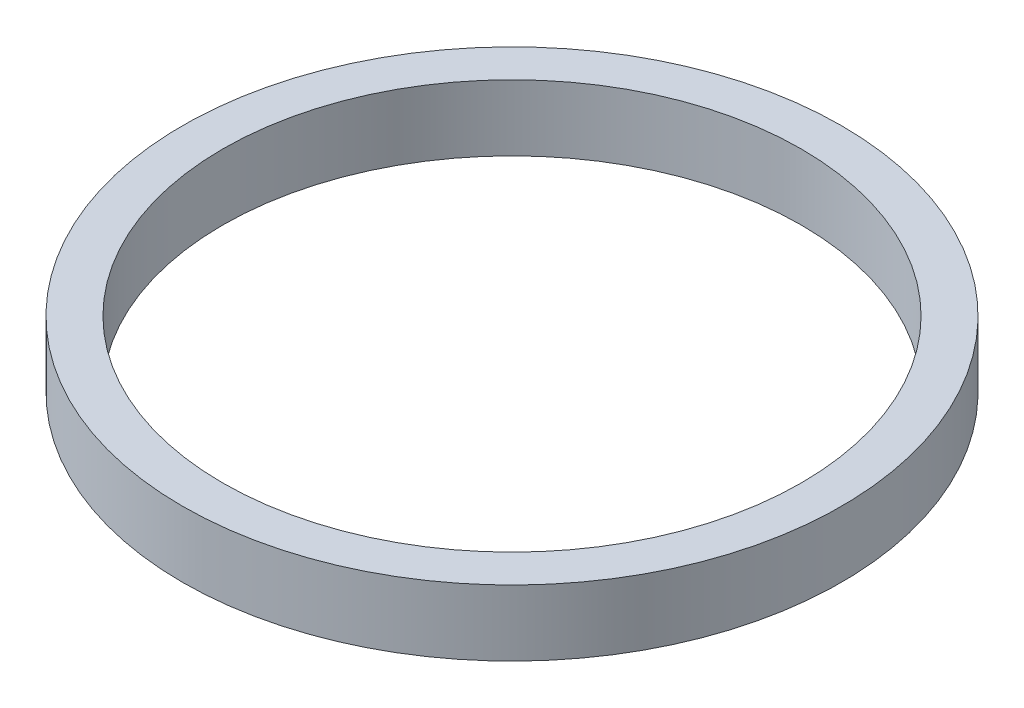
ISO-10303-21;
HEADER;
FILE_DESCRIPTION(('STEP AP214'),'2;1');
FILE_NAME('part.step','',(''),(''),'','','');
FILE_SCHEMA(('AUTOMOTIVE_DESIGN { 1 0 10303 214 1 1 1 1 }'));
ENDSEC;
DATA;
#1=APPLICATION_CONTEXT('core data for automotive mechanical design processes');
#2=APPLICATION_PROTOCOL_DEFINITION('international standard','automotive_design',2000,#1);
#3=PRODUCT_CONTEXT('',#1,'mechanical');
#4=PRODUCT('Part','Part','',(#3));
#5=PRODUCT_RELATED_PRODUCT_CATEGORY('part','',(#4));
#6=PRODUCT_DEFINITION_FORMATION('','',#4);
#7=PRODUCT_DEFINITION_CONTEXT('part definition',#1,'design');
#8=PRODUCT_DEFINITION('design','',#6,#7);
#9=PRODUCT_DEFINITION_SHAPE('','',#8);
#10=(LENGTH_UNIT() NAMED_UNIT(*) SI_UNIT(.MILLI.,.METRE.));
#11=(NAMED_UNIT(*) PLANE_ANGLE_UNIT() SI_UNIT($,.RADIAN.));
#12=(NAMED_UNIT(*) SI_UNIT($,.STERADIAN.) SOLID_ANGLE_UNIT());
#13=UNCERTAINTY_MEASURE_WITH_UNIT(LENGTH_MEASURE(1.E-05),#10,'distance_accuracy_value','');
#14=(GEOMETRIC_REPRESENTATION_CONTEXT(3) GLOBAL_UNCERTAINTY_ASSIGNED_CONTEXT((#13)) GLOBAL_UNIT_ASSIGNED_CONTEXT((#10,
#11,#12)) REPRESENTATION_CONTEXT('',''));
#15=CARTESIAN_POINT('',(0.,0.,0.));
#16=DIRECTION('',(0.,0.,1.));
#17=DIRECTION('',(1.,0.,0.));
#18=AXIS2_PLACEMENT_3D('',#15,#16,#17);
#19=CARTESIAN_POINT('',(0.,1.8,0.));
#20=DIRECTION('',(0.,1.,0.));
#21=DIRECTION('',(0.,0.,1.));
#22=AXIS2_PLACEMENT_3D('',#19,#20,#21);
#23=PLANE('',#22);
#24=CARTESIAN_POINT('',(0.,1.8,0.));
#25=DIRECTION('',(0.,1.,0.));
#26=DIRECTION('',(0.,0.,1.));
#27=AXIS2_PLACEMENT_3D('',#24,#25,#26);
#28=CIRCLE('',#27,9.);
#29=CARTESIAN_POINT('',(0.,1.8,9.));
#30=VERTEX_POINT('',#29);
#31=EDGE_CURVE('E11',#30,#30,#28,.T.);
#32=ORIENTED_EDGE('',*,*,#31,.T.);
#33=EDGE_LOOP('',(#32));
#34=FACE_BOUND('',#33,.T.);
#35=CARTESIAN_POINT('',(0.,1.8,0.));
#36=DIRECTION('',(0.,1.,0.));
#37=DIRECTION('',(0.,0.,1.));
#38=AXIS2_PLACEMENT_3D('',#35,#36,#37);
#39=CIRCLE('',#38,7.9);
#40=CARTESIAN_POINT('',(0.,1.8,7.9));
#41=VERTEX_POINT('',#40);
#42=EDGE_CURVE('E50',#41,#41,#39,.T.);
#43=ORIENTED_EDGE('',*,*,#42,.F.);
#44=EDGE_LOOP('',(#43));
#45=FACE_BOUND('',#44,.T.);
#46=ADVANCED_FACE('F39',(#34,#45),#23,.T.);
#47=CARTESIAN_POINT('',(0.,0.,0.));
#48=DIRECTION('',(0.,1.,0.));
#49=DIRECTION('',(0.,0.,1.));
#50=AXIS2_PLACEMENT_3D('',#47,#48,#49);
#51=PLANE('',#50);
#52=CARTESIAN_POINT('',(0.,0.,0.));
#53=DIRECTION('',(0.,1.,0.));
#54=DIRECTION('',(0.,0.,1.));
#55=AXIS2_PLACEMENT_3D('',#52,#53,#54);
#56=CIRCLE('',#55,9.);
#57=CARTESIAN_POINT('',(0.,0.,9.));
#58=VERTEX_POINT('',#57);
#59=EDGE_CURVE('E43',#58,#58,#56,.T.);
#60=ORIENTED_EDGE('',*,*,#59,.F.);
#61=EDGE_LOOP('',(#60));
#62=FACE_BOUND('',#61,.T.);
#63=CARTESIAN_POINT('',(0.,0.,0.));
#64=DIRECTION('',(0.,1.,0.));
#65=DIRECTION('',(0.,0.,1.));
#66=AXIS2_PLACEMENT_3D('',#63,#64,#65);
#67=CIRCLE('',#66,7.9);
#68=CARTESIAN_POINT('',(0.,0.,7.9));
#69=VERTEX_POINT('',#68);
#70=EDGE_CURVE('E52',#69,#69,#67,.T.);
#71=ORIENTED_EDGE('',*,*,#70,.T.);
#72=EDGE_LOOP('',(#71));
#73=FACE_BOUND('',#72,.T.);
#74=ADVANCED_FACE('F62',(#62,#73),#51,.F.);
#75=CARTESIAN_POINT('',(0.,1.8,0.));
#76=DIRECTION('',(0.,-1.,0.));
#77=DIRECTION('',(0.,0.,-1.));
#78=AXIS2_PLACEMENT_3D('',#75,#76,#77);
#79=CYLINDRICAL_SURFACE('',#78,9.);
#80=ORIENTED_EDGE('',*,*,#31,.F.);
#81=EDGE_LOOP('',(#80));
#82=FACE_BOUND('',#81,.T.);
#83=ORIENTED_EDGE('',*,*,#59,.T.);
#84=EDGE_LOOP('',(#83));
#85=FACE_BOUND('',#84,.T.);
#86=ADVANCED_FACE('F41',(#82,#85),#79,.T.);
#87=CARTESIAN_POINT('',(0.,1.8,0.));
#88=DIRECTION('',(0.,-1.,0.));
#89=DIRECTION('',(0.,0.,-1.));
#90=AXIS2_PLACEMENT_3D('',#87,#88,#89);
#91=CYLINDRICAL_SURFACE('',#90,7.9);
#92=ORIENTED_EDGE('',*,*,#42,.T.);
#93=EDGE_LOOP('',(#92));
#94=FACE_BOUND('',#93,.T.);
#95=ORIENTED_EDGE('',*,*,#70,.F.);
#96=EDGE_LOOP('',(#95));
#97=FACE_BOUND('',#96,.T.);
#98=ADVANCED_FACE('F58',(#94,#97),#91,.F.);
#99=CLOSED_SHELL('',(#46,#74,#86,#98));
#100=MANIFOLD_SOLID_BREP('B2',#99);
#101=ADVANCED_BREP_SHAPE_REPRESENTATION('',(#18,#100),#14);
#102=SHAPE_DEFINITION_REPRESENTATION(#9,#101);
ENDSEC;
END-ISO-10303-21;
